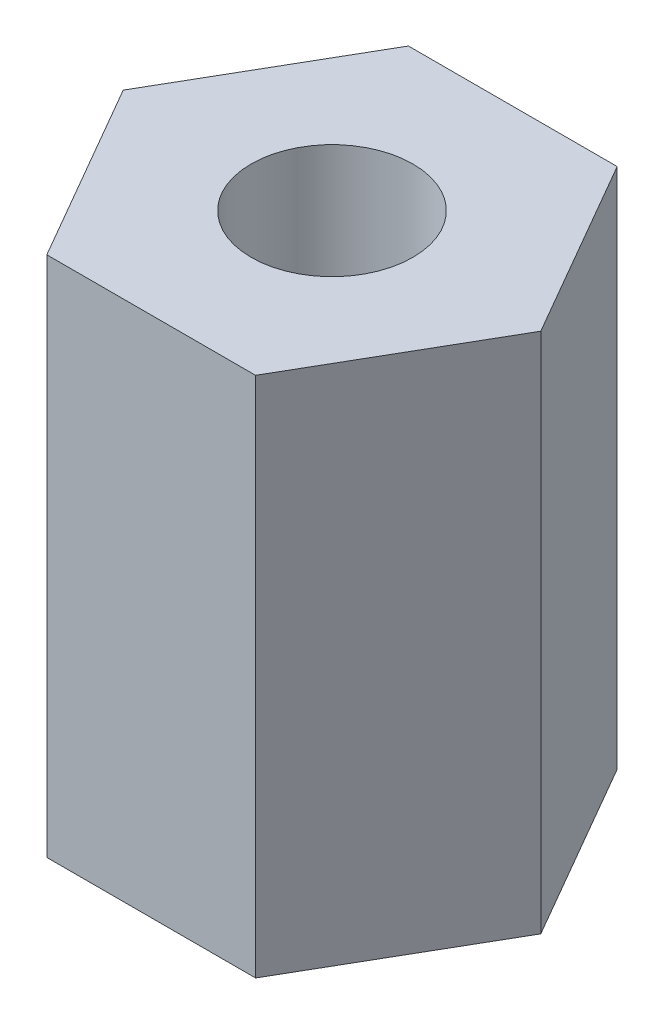
ISO-10303-21;
HEADER;
FILE_DESCRIPTION(('STEP AP214'),'2;1');
FILE_NAME('part.step','',(''),(''),'','','');
FILE_SCHEMA(('AUTOMOTIVE_DESIGN { 1 0 10303 214 1 1 1 1 }'));
ENDSEC;
DATA;
#1=APPLICATION_CONTEXT('core data for automotive mechanical design processes');
#2=APPLICATION_PROTOCOL_DEFINITION('international standard','automotive_design',2000,#1);
#3=PRODUCT_CONTEXT('',#1,'mechanical');
#4=PRODUCT('Part','Part','',(#3));
#5=PRODUCT_RELATED_PRODUCT_CATEGORY('part','',(#4));
#6=PRODUCT_DEFINITION_FORMATION('','',#4);
#7=PRODUCT_DEFINITION_CONTEXT('part definition',#1,'design');
#8=PRODUCT_DEFINITION('design','',#6,#7);
#9=PRODUCT_DEFINITION_SHAPE('','',#8);
#10=(LENGTH_UNIT() NAMED_UNIT(*) SI_UNIT(.MILLI.,.METRE.));
#11=(NAMED_UNIT(*) PLANE_ANGLE_UNIT() SI_UNIT($,.RADIAN.));
#12=(NAMED_UNIT(*) SI_UNIT($,.STERADIAN.) SOLID_ANGLE_UNIT());
#13=UNCERTAINTY_MEASURE_WITH_UNIT(LENGTH_MEASURE(1.E-05),#10,'distance_accuracy_value','');
#14=(GEOMETRIC_REPRESENTATION_CONTEXT(3) GLOBAL_UNCERTAINTY_ASSIGNED_CONTEXT((#13)) GLOBAL_UNIT_ASSIGNED_CONTEXT((#10,
#11,#12)) REPRESENTATION_CONTEXT('',''));
#15=CARTESIAN_POINT('',(0.,0.,0.));
#16=DIRECTION('',(0.,0.,1.));
#17=DIRECTION('',(1.,0.,0.));
#18=AXIS2_PLACEMENT_3D('',#15,#16,#17);
#19=CARTESIAN_POINT('',(0.,10.,0.));
#20=DIRECTION('',(0.,1.,0.));
#21=DIRECTION('',(0.,0.,1.));
#22=AXIS2_PLACEMENT_3D('',#19,#20,#21);
#23=PLANE('',#22);
#24=DIRECTION('',(-0.5,0.,-0.866025403784438));
#25=VECTOR('',#24,1.);
#26=CARTESIAN_POINT('',(4.,10.,0.));
#27=LINE('',#26,#25);
#28=CARTESIAN_POINT('',(4.,10.,0.));
#29=VERTEX_POINT('',#28);
#30=CARTESIAN_POINT('',(2.,10.,-3.46410161513775));
#31=VERTEX_POINT('',#30);
#32=EDGE_CURVE('E167',#29,#31,#27,.T.);
#33=ORIENTED_EDGE('',*,*,#32,.T.);
#34=DIRECTION('',(-1.,0.,0.));
#35=VECTOR('',#34,1.);
#36=CARTESIAN_POINT('',(2.,10.,-3.46410161513775));
#37=LINE('',#36,#35);
#38=CARTESIAN_POINT('',(-2.,10.,-3.46410161513776));
#39=VERTEX_POINT('',#38);
#40=EDGE_CURVE('E115',#31,#39,#37,.T.);
#41=ORIENTED_EDGE('',*,*,#40,.T.);
#42=DIRECTION('',(-0.5,0.,0.866025403784439));
#43=VECTOR('',#42,1.);
#44=CARTESIAN_POINT('',(-2.,10.,-3.46410161513776));
#45=LINE('',#44,#43);
#46=CARTESIAN_POINT('',(-4.,10.,0.));
#47=VERTEX_POINT('',#46);
#48=EDGE_CURVE('E128',#39,#47,#45,.T.);
#49=ORIENTED_EDGE('',*,*,#48,.T.);
#50=DIRECTION('',(0.5,0.,0.866025403784439));
#51=VECTOR('',#50,1.);
#52=CARTESIAN_POINT('',(-4.,10.,0.));
#53=LINE('',#52,#51);
#54=CARTESIAN_POINT('',(-2.,10.,3.46410161513775));
#55=VERTEX_POINT('',#54);
#56=EDGE_CURVE('E122',#47,#55,#53,.T.);
#57=ORIENTED_EDGE('',*,*,#56,.T.);
#58=DIRECTION('',(1.,0.,0.));
#59=VECTOR('',#58,1.);
#60=CARTESIAN_POINT('',(-2.,10.,3.46410161513775));
#61=LINE('',#60,#59);
#62=CARTESIAN_POINT('',(2.,10.,3.46410161513776));
#63=VERTEX_POINT('',#62);
#64=EDGE_CURVE('E126',#55,#63,#61,.T.);
#65=ORIENTED_EDGE('',*,*,#64,.T.);
#66=DIRECTION('',(0.5,0.,-0.866025403784439));
#67=VECTOR('',#66,1.);
#68=CARTESIAN_POINT('',(2.,10.,3.46410161513776));
#69=LINE('',#68,#67);
#70=EDGE_CURVE('E78',#63,#29,#69,.T.);
#71=ORIENTED_EDGE('',*,*,#70,.T.);
#72=EDGE_LOOP('',(#33,#41,#49,#57,#65,#71));
#73=FACE_BOUND('',#72,.T.);
#74=CARTESIAN_POINT('',(0.,10.,0.));
#75=DIRECTION('',(0.,1.,0.));
#76=DIRECTION('',(0.,0.,1.));
#77=AXIS2_PLACEMENT_3D('',#74,#75,#76);
#78=CIRCLE('',#77,1.55);
#79=CARTESIAN_POINT('',(0.,10.,1.55));
#80=VERTEX_POINT('',#79);
#81=EDGE_CURVE('E155',#80,#80,#78,.T.);
#82=ORIENTED_EDGE('',*,*,#81,.F.);
#83=EDGE_LOOP('',(#82));
#84=FACE_BOUND('',#83,.T.);
#85=ADVANCED_FACE('F60',(#73,#84),#23,.T.);
#86=CARTESIAN_POINT('',(0.,0.,0.));
#87=DIRECTION('',(0.,1.,0.));
#88=DIRECTION('',(0.,0.,1.));
#89=AXIS2_PLACEMENT_3D('',#86,#87,#88);
#90=PLANE('',#89);
#91=DIRECTION('',(-0.5,0.,-0.866025403784438));
#92=VECTOR('',#91,1.);
#93=CARTESIAN_POINT('',(4.,0.,0.));
#94=LINE('',#93,#92);
#95=CARTESIAN_POINT('',(4.,0.,0.));
#96=VERTEX_POINT('',#95);
#97=CARTESIAN_POINT('',(2.,0.,-3.46410161513775));
#98=VERTEX_POINT('',#97);
#99=EDGE_CURVE('E150',#96,#98,#94,.T.);
#100=ORIENTED_EDGE('',*,*,#99,.F.);
#101=DIRECTION('',(0.5,0.,-0.866025403784439));
#102=VECTOR('',#101,1.);
#103=CARTESIAN_POINT('',(2.,0.,3.46410161513776));
#104=LINE('',#103,#102);
#105=CARTESIAN_POINT('',(2.,0.,3.46410161513776));
#106=VERTEX_POINT('',#105);
#107=EDGE_CURVE('E107',#106,#96,#104,.T.);
#108=ORIENTED_EDGE('',*,*,#107,.F.);
#109=DIRECTION('',(1.,0.,0.));
#110=VECTOR('',#109,1.);
#111=CARTESIAN_POINT('',(-2.,0.,3.46410161513775));
#112=LINE('',#111,#110);
#113=CARTESIAN_POINT('',(-2.,0.,3.46410161513775));
#114=VERTEX_POINT('',#113);
#115=EDGE_CURVE('E101',#114,#106,#112,.T.);
#116=ORIENTED_EDGE('',*,*,#115,.F.);
#117=DIRECTION('',(0.5,0.,0.866025403784439));
#118=VECTOR('',#117,1.);
#119=CARTESIAN_POINT('',(-4.,0.,0.));
#120=LINE('',#119,#118);
#121=CARTESIAN_POINT('',(-4.,0.,0.));
#122=VERTEX_POINT('',#121);
#123=EDGE_CURVE('E137',#122,#114,#120,.T.);
#124=ORIENTED_EDGE('',*,*,#123,.F.);
#125=DIRECTION('',(-0.5,0.,0.866025403784439));
#126=VECTOR('',#125,1.);
#127=CARTESIAN_POINT('',(-2.,0.,-3.46410161513776));
#128=LINE('',#127,#126);
#129=CARTESIAN_POINT('',(-2.,0.,-3.46410161513776));
#130=VERTEX_POINT('',#129);
#131=EDGE_CURVE('E158',#130,#122,#128,.T.);
#132=ORIENTED_EDGE('',*,*,#131,.F.);
#133=DIRECTION('',(-1.,0.,0.));
#134=VECTOR('',#133,1.);
#135=CARTESIAN_POINT('',(2.,0.,-3.46410161513775));
#136=LINE('',#135,#134);
#137=EDGE_CURVE('E154',#98,#130,#136,.T.);
#138=ORIENTED_EDGE('',*,*,#137,.F.);
#139=EDGE_LOOP('',(#100,#108,#116,#124,#132,#138));
#140=FACE_BOUND('',#139,.T.);
#141=CARTESIAN_POINT('',(0.,0.,0.));
#142=DIRECTION('',(0.,1.,0.));
#143=DIRECTION('',(0.,0.,1.));
#144=AXIS2_PLACEMENT_3D('',#141,#142,#143);
#145=CIRCLE('',#144,1.55);
#146=CARTESIAN_POINT('',(0.,0.,1.55));
#147=VERTEX_POINT('',#146);
#148=EDGE_CURVE('E264',#147,#147,#145,.T.);
#149=ORIENTED_EDGE('',*,*,#148,.T.);
#150=EDGE_LOOP('',(#149));
#151=FACE_BOUND('',#150,.T.);
#152=ADVANCED_FACE('F180',(#140,#151),#90,.F.);
#153=CARTESIAN_POINT('',(4.,10.,0.));
#154=DIRECTION('',(-0.866025403784439,0.,0.5));
#155=DIRECTION('',(0.5,0.,0.866025403784439));
#156=AXIS2_PLACEMENT_3D('',#153,#154,#155);
#157=PLANE('',#156);
#158=ORIENTED_EDGE('',*,*,#99,.T.);
#159=DIRECTION('',(0.,-1.,0.));
#160=VECTOR('',#159,1.);
#161=CARTESIAN_POINT('',(2.,10.,-3.46410161513775));
#162=LINE('',#161,#160);
#163=EDGE_CURVE('E12',#31,#98,#162,.T.);
#164=ORIENTED_EDGE('',*,*,#163,.F.);
#165=ORIENTED_EDGE('',*,*,#32,.F.);
#166=DIRECTION('',(0.,-1.,0.));
#167=VECTOR('',#166,1.);
#168=CARTESIAN_POINT('',(4.,10.,0.));
#169=LINE('',#168,#167);
#170=EDGE_CURVE('E146',#29,#96,#169,.T.);
#171=ORIENTED_EDGE('',*,*,#170,.T.);
#172=EDGE_LOOP('',(#158,#164,#165,#171));
#173=FACE_BOUND('',#172,.T.);
#174=ADVANCED_FACE('F62',(#173),#157,.F.);
#175=CARTESIAN_POINT('',(2.,10.,-3.46410161513775));
#176=DIRECTION('',(0.,0.,1.));
#177=DIRECTION('',(1.,0.,0.));
#178=AXIS2_PLACEMENT_3D('',#175,#176,#177);
#179=PLANE('',#178);
#180=ORIENTED_EDGE('',*,*,#137,.T.);
#181=DIRECTION('',(0.,-1.,0.));
#182=VECTOR('',#181,1.);
#183=CARTESIAN_POINT('',(-2.,10.,-3.46410161513776));
#184=LINE('',#183,#182);
#185=EDGE_CURVE('E70',#39,#130,#184,.T.);
#186=ORIENTED_EDGE('',*,*,#185,.F.);
#187=ORIENTED_EDGE('',*,*,#40,.F.);
#188=ORIENTED_EDGE('',*,*,#163,.T.);
#189=EDGE_LOOP('',(#180,#186,#187,#188));
#190=FACE_BOUND('',#189,.T.);
#191=ADVANCED_FACE('F205',(#190),#179,.F.);
#192=CARTESIAN_POINT('',(-2.,10.,-3.46410161513776));
#193=DIRECTION('',(0.866025403784439,0.,0.5));
#194=DIRECTION('',(0.5,0.,-0.866025403784439));
#195=AXIS2_PLACEMENT_3D('',#192,#193,#194);
#196=PLANE('',#195);
#197=ORIENTED_EDGE('',*,*,#131,.T.);
#198=DIRECTION('',(0.,-1.,0.));
#199=VECTOR('',#198,1.);
#200=CARTESIAN_POINT('',(-4.,10.,0.));
#201=LINE('',#200,#199);
#202=EDGE_CURVE('E139',#47,#122,#201,.T.);
#203=ORIENTED_EDGE('',*,*,#202,.F.);
#204=ORIENTED_EDGE('',*,*,#48,.F.);
#205=ORIENTED_EDGE('',*,*,#185,.T.);
#206=EDGE_LOOP('',(#197,#203,#204,#205));
#207=FACE_BOUND('',#206,.T.);
#208=ADVANCED_FACE('F177',(#207),#196,.F.);
#209=CARTESIAN_POINT('',(-4.,10.,0.));
#210=DIRECTION('',(0.866025403784438,0.,-0.5));
#211=DIRECTION('',(-0.5,0.,-0.866025403784439));
#212=AXIS2_PLACEMENT_3D('',#209,#210,#211);
#213=PLANE('',#212);
#214=ORIENTED_EDGE('',*,*,#123,.T.);
#215=DIRECTION('',(0.,-1.,0.));
#216=VECTOR('',#215,1.);
#217=CARTESIAN_POINT('',(-2.,10.,3.46410161513775));
#218=LINE('',#217,#216);
#219=EDGE_CURVE('E134',#55,#114,#218,.T.);
#220=ORIENTED_EDGE('',*,*,#219,.F.);
#221=ORIENTED_EDGE('',*,*,#56,.F.);
#222=ORIENTED_EDGE('',*,*,#202,.T.);
#223=EDGE_LOOP('',(#214,#220,#221,#222));
#224=FACE_BOUND('',#223,.T.);
#225=ADVANCED_FACE('F135',(#224),#213,.F.);
#226=CARTESIAN_POINT('',(-2.,10.,3.46410161513775));
#227=DIRECTION('',(0.,0.,-1.));
#228=DIRECTION('',(-1.,0.,0.));
#229=AXIS2_PLACEMENT_3D('',#226,#227,#228);
#230=PLANE('',#229);
#231=ORIENTED_EDGE('',*,*,#115,.T.);
#232=DIRECTION('',(0.,-1.,0.));
#233=VECTOR('',#232,1.);
#234=CARTESIAN_POINT('',(2.,10.,3.46410161513776));
#235=LINE('',#234,#233);
#236=EDGE_CURVE('E140',#63,#106,#235,.T.);
#237=ORIENTED_EDGE('',*,*,#236,.F.);
#238=ORIENTED_EDGE('',*,*,#64,.F.);
#239=ORIENTED_EDGE('',*,*,#219,.T.);
#240=EDGE_LOOP('',(#231,#237,#238,#239));
#241=FACE_BOUND('',#240,.T.);
#242=ADVANCED_FACE('F142',(#241),#230,.F.);
#243=CARTESIAN_POINT('',(2.,10.,3.46410161513776));
#244=DIRECTION('',(-0.866025403784439,0.,-0.5));
#245=DIRECTION('',(-0.5,0.,0.866025403784439));
#246=AXIS2_PLACEMENT_3D('',#243,#244,#245);
#247=PLANE('',#246);
#248=ORIENTED_EDGE('',*,*,#107,.T.);
#249=ORIENTED_EDGE('',*,*,#170,.F.);
#250=ORIENTED_EDGE('',*,*,#70,.F.);
#251=ORIENTED_EDGE('',*,*,#236,.T.);
#252=EDGE_LOOP('',(#248,#249,#250,#251));
#253=FACE_BOUND('',#252,.T.);
#254=ADVANCED_FACE('F185',(#253),#247,.F.);
#255=CARTESIAN_POINT('',(0.,10.,0.));
#256=DIRECTION('',(0.,-1.,0.));
#257=DIRECTION('',(0.,0.,-1.));
#258=AXIS2_PLACEMENT_3D('',#255,#256,#257);
#259=CYLINDRICAL_SURFACE('',#258,1.55);
#260=ORIENTED_EDGE('',*,*,#81,.T.);
#261=EDGE_LOOP('',(#260));
#262=FACE_BOUND('',#261,.T.);
#263=ORIENTED_EDGE('',*,*,#148,.F.);
#264=EDGE_LOOP('',(#263));
#265=FACE_BOUND('',#264,.T.);
#266=ADVANCED_FACE('F187',(#262,#265),#259,.F.);
#267=CLOSED_SHELL('',(#85,#152,#174,#191,#208,#225,#242,#254,#266));
#268=MANIFOLD_SOLID_BREP('B2',#267);
#269=ADVANCED_BREP_SHAPE_REPRESENTATION('',(#18,#268),#14);
#270=SHAPE_DEFINITION_REPRESENTATION(#9,#269);
ENDSEC;
END-ISO-10303-21;
